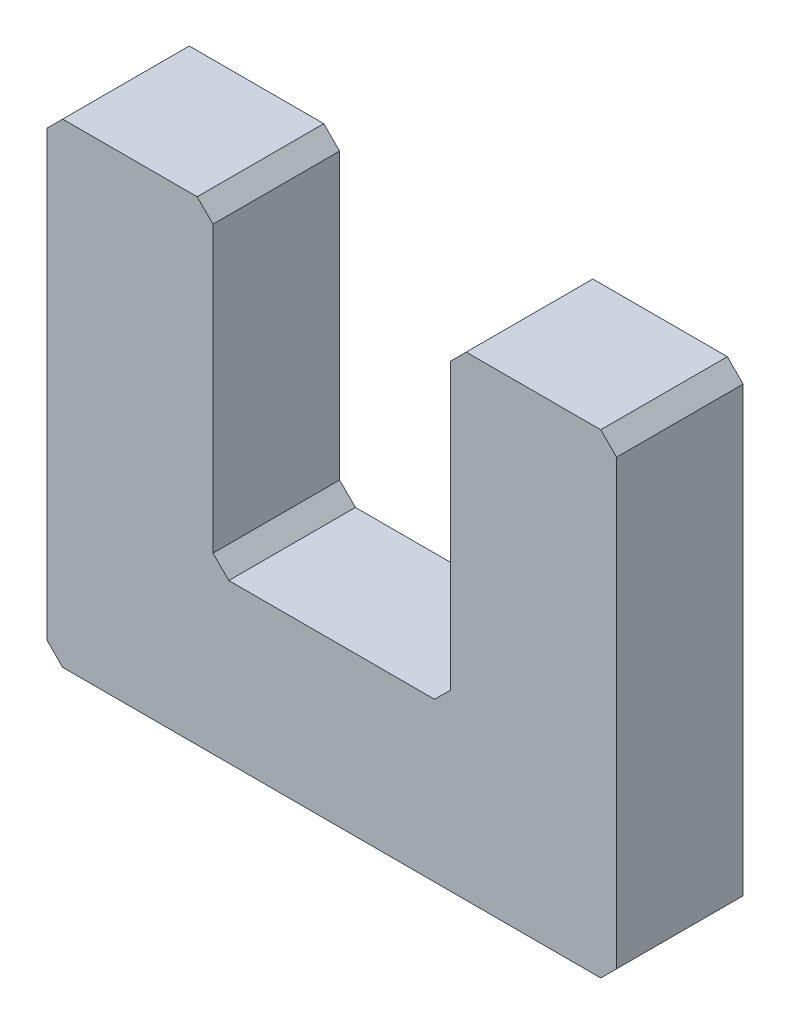
ISO-10303-21;
HEADER;
FILE_DESCRIPTION(('STEP AP214'),'2;1');
FILE_NAME('part.step','',(''),(''),'','','');
FILE_SCHEMA(('AUTOMOTIVE_DESIGN { 1 0 10303 214 1 1 1 1 }'));
ENDSEC;
DATA;
#1=APPLICATION_CONTEXT('core data for automotive mechanical design processes');
#2=APPLICATION_PROTOCOL_DEFINITION('international standard','automotive_design',2000,#1);
#3=PRODUCT_CONTEXT('',#1,'mechanical');
#4=PRODUCT('Part','Part','',(#3));
#5=PRODUCT_RELATED_PRODUCT_CATEGORY('part','',(#4));
#6=PRODUCT_DEFINITION_FORMATION('','',#4);
#7=PRODUCT_DEFINITION_CONTEXT('part definition',#1,'design');
#8=PRODUCT_DEFINITION('design','',#6,#7);
#9=PRODUCT_DEFINITION_SHAPE('','',#8);
#10=(LENGTH_UNIT() NAMED_UNIT(*) SI_UNIT(.MILLI.,.METRE.));
#11=(NAMED_UNIT(*) PLANE_ANGLE_UNIT() SI_UNIT($,.RADIAN.));
#12=(NAMED_UNIT(*) SI_UNIT($,.STERADIAN.) SOLID_ANGLE_UNIT());
#13=UNCERTAINTY_MEASURE_WITH_UNIT(LENGTH_MEASURE(1.E-05),#10,'distance_accuracy_value','');
#14=(GEOMETRIC_REPRESENTATION_CONTEXT(3) GLOBAL_UNCERTAINTY_ASSIGNED_CONTEXT((#13)) GLOBAL_UNIT_ASSIGNED_CONTEXT((#10,
#11,#12)) REPRESENTATION_CONTEXT('',''));
#15=CARTESIAN_POINT('',(0.,0.,0.));
#16=DIRECTION('',(0.,0.,1.));
#17=DIRECTION('',(1.,0.,0.));
#18=AXIS2_PLACEMENT_3D('',#15,#16,#17);
#19=CARTESIAN_POINT('',(-18.,15.,8.));
#20=DIRECTION('',(0.,-1.,0.));
#21=DIRECTION('',(0.,0.,-1.));
#22=AXIS2_PLACEMENT_3D('',#19,#20,#21);
#23=PLANE('',#22);
#24=DIRECTION('',(-1.,0.,0.));
#25=VECTOR('',#24,1.);
#26=CARTESIAN_POINT('',(-18.,15.,0.));
#27=LINE('',#26,#25);
#28=CARTESIAN_POINT('',(17.,15.,0.));
#29=VERTEX_POINT('',#28);
#30=CARTESIAN_POINT('',(8.50000000000001,15.,0.));
#31=VERTEX_POINT('',#30);
#32=EDGE_CURVE('E201',#29,#31,#27,.T.);
#33=ORIENTED_EDGE('',*,*,#32,.T.);
#34=DIRECTION('',(0.,0.,1.));
#35=VECTOR('',#34,1.);
#36=CARTESIAN_POINT('',(8.50000000000001,15.,8.));
#37=LINE('',#36,#35);
#38=CARTESIAN_POINT('',(8.50000000000001,15.,8.));
#39=VERTEX_POINT('',#38);
#40=EDGE_CURVE('E246',#31,#39,#37,.T.);
#41=ORIENTED_EDGE('',*,*,#40,.T.);
#42=DIRECTION('',(-1.,0.,0.));
#43=VECTOR('',#42,1.);
#44=CARTESIAN_POINT('',(-18.,15.,8.));
#45=LINE('',#44,#43);
#46=CARTESIAN_POINT('',(17.,15.,8.));
#47=VERTEX_POINT('',#46);
#48=EDGE_CURVE('E299',#47,#39,#45,.T.);
#49=ORIENTED_EDGE('',*,*,#48,.F.);
#50=DIRECTION('',(0.,0.,-1.));
#51=VECTOR('',#50,1.);
#52=CARTESIAN_POINT('',(17.,15.,8.));
#53=LINE('',#52,#51);
#54=EDGE_CURVE('E242',#47,#29,#53,.T.);
#55=ORIENTED_EDGE('',*,*,#54,.T.);
#56=EDGE_LOOP('',(#33,#41,#49,#55));
#57=FACE_BOUND('',#56,.T.);
#58=ADVANCED_FACE('F47',(#57),#23,.F.);
#59=CARTESIAN_POINT('',(18.,-15.,8.));
#60=DIRECTION('',(-1.,0.,0.));
#61=DIRECTION('',(0.,0.,1.));
#62=AXIS2_PLACEMENT_3D('',#59,#60,#61);
#63=PLANE('',#62);
#64=DIRECTION('',(0.,1.,0.));
#65=VECTOR('',#64,1.);
#66=CARTESIAN_POINT('',(18.,-15.,8.));
#67=LINE('',#66,#65);
#68=CARTESIAN_POINT('',(18.,-14.,8.));
#69=VERTEX_POINT('',#68);
#70=CARTESIAN_POINT('',(18.,14.,8.));
#71=VERTEX_POINT('',#70);
#72=EDGE_CURVE('E193',#69,#71,#67,.T.);
#73=ORIENTED_EDGE('',*,*,#72,.F.);
#74=DIRECTION('',(0.,0.,-1.));
#75=VECTOR('',#74,1.);
#76=CARTESIAN_POINT('',(18.,-14.,8.));
#77=LINE('',#76,#75);
#78=CARTESIAN_POINT('',(18.,-14.,0.));
#79=VERTEX_POINT('',#78);
#80=EDGE_CURVE('E238',#69,#79,#77,.T.);
#81=ORIENTED_EDGE('',*,*,#80,.T.);
#82=DIRECTION('',(0.,1.,0.));
#83=VECTOR('',#82,1.);
#84=CARTESIAN_POINT('',(18.,-15.,0.));
#85=LINE('',#84,#83);
#86=CARTESIAN_POINT('',(18.,14.,0.));
#87=VERTEX_POINT('',#86);
#88=EDGE_CURVE('E307',#79,#87,#85,.T.);
#89=ORIENTED_EDGE('',*,*,#88,.T.);
#90=DIRECTION('',(0.,0.,1.));
#91=VECTOR('',#90,1.);
#92=CARTESIAN_POINT('',(18.,14.,8.));
#93=LINE('',#92,#91);
#94=EDGE_CURVE('E235',#87,#71,#93,.T.);
#95=ORIENTED_EDGE('',*,*,#94,.T.);
#96=EDGE_LOOP('',(#73,#81,#89,#95));
#97=FACE_BOUND('',#96,.T.);
#98=ADVANCED_FACE('F340',(#97),#63,.F.);
#99=CARTESIAN_POINT('',(-8.50000000000001,15.,8.));
#100=VERTEX_POINT('',#99);
#101=CARTESIAN_POINT('',(-17.,15.,8.));
#102=VERTEX_POINT('',#101);
#103=EDGE_CURVE('E199',#100,#102,#45,.T.);
#104=ORIENTED_EDGE('',*,*,#103,.F.);
#105=DIRECTION('',(0.,0.,-1.));
#106=VECTOR('',#105,1.);
#107=CARTESIAN_POINT('',(-8.50000000000001,15.,8.));
#108=LINE('',#107,#106);
#109=CARTESIAN_POINT('',(-8.50000000000001,15.,0.));
#110=VERTEX_POINT('',#109);
#111=EDGE_CURVE('E271',#100,#110,#108,.T.);
#112=ORIENTED_EDGE('',*,*,#111,.T.);
#113=CARTESIAN_POINT('',(-17.,15.,0.));
#114=VERTEX_POINT('',#113);
#115=EDGE_CURVE('E310',#110,#114,#27,.T.);
#116=ORIENTED_EDGE('',*,*,#115,.T.);
#117=DIRECTION('',(0.,0.,1.));
#118=VECTOR('',#117,1.);
#119=CARTESIAN_POINT('',(-17.,15.,8.));
#120=LINE('',#119,#118);
#121=EDGE_CURVE('E231',#114,#102,#120,.T.);
#122=ORIENTED_EDGE('',*,*,#121,.T.);
#123=EDGE_LOOP('',(#104,#112,#116,#122));
#124=FACE_BOUND('',#123,.T.);
#125=ADVANCED_FACE('F320',(#124),#23,.F.);
#126=CARTESIAN_POINT('',(-18.,-15.,8.));
#127=DIRECTION('',(1.,0.,0.));
#128=DIRECTION('',(0.,0.,-1.));
#129=AXIS2_PLACEMENT_3D('',#126,#127,#128);
#130=PLANE('',#129);
#131=DIRECTION('',(0.,-1.,0.));
#132=VECTOR('',#131,1.);
#133=CARTESIAN_POINT('',(-18.,-15.,0.));
#134=LINE('',#133,#132);
#135=CARTESIAN_POINT('',(-18.,14.,0.));
#136=VERTEX_POINT('',#135);
#137=CARTESIAN_POINT('',(-18.,-14.,0.));
#138=VERTEX_POINT('',#137);
#139=EDGE_CURVE('E194',#136,#138,#134,.T.);
#140=ORIENTED_EDGE('',*,*,#139,.T.);
#141=DIRECTION('',(0.,0.,1.));
#142=VECTOR('',#141,1.);
#143=CARTESIAN_POINT('',(-18.,-14.,8.));
#144=LINE('',#143,#142);
#145=CARTESIAN_POINT('',(-18.,-14.,8.));
#146=VERTEX_POINT('',#145);
#147=EDGE_CURVE('E167',#138,#146,#144,.T.);
#148=ORIENTED_EDGE('',*,*,#147,.T.);
#149=DIRECTION('',(0.,-1.,0.));
#150=VECTOR('',#149,1.);
#151=CARTESIAN_POINT('',(-18.,-15.,8.));
#152=LINE('',#151,#150);
#153=CARTESIAN_POINT('',(-18.,14.,8.));
#154=VERTEX_POINT('',#153);
#155=EDGE_CURVE('E295',#154,#146,#152,.T.);
#156=ORIENTED_EDGE('',*,*,#155,.F.);
#157=DIRECTION('',(0.,0.,-1.));
#158=VECTOR('',#157,1.);
#159=CARTESIAN_POINT('',(-18.,14.,8.));
#160=LINE('',#159,#158);
#161=EDGE_CURVE('E173',#154,#136,#160,.T.);
#162=ORIENTED_EDGE('',*,*,#161,.T.);
#163=EDGE_LOOP('',(#140,#148,#156,#162));
#164=FACE_BOUND('',#163,.T.);
#165=ADVANCED_FACE('F331',(#164),#130,.F.);
#166=CARTESIAN_POINT('',(-18.,-15.,8.));
#167=DIRECTION('',(0.,1.,0.));
#168=DIRECTION('',(0.,0.,1.));
#169=AXIS2_PLACEMENT_3D('',#166,#167,#168);
#170=PLANE('',#169);
#171=DIRECTION('',(1.,0.,0.));
#172=VECTOR('',#171,1.);
#173=CARTESIAN_POINT('',(-18.,-15.,8.));
#174=LINE('',#173,#172);
#175=CARTESIAN_POINT('',(-17.,-15.,8.));
#176=VERTEX_POINT('',#175);
#177=CARTESIAN_POINT('',(17.,-15.,8.));
#178=VERTEX_POINT('',#177);
#179=EDGE_CURVE('E183',#176,#178,#174,.T.);
#180=ORIENTED_EDGE('',*,*,#179,.F.);
#181=DIRECTION('',(0.,0.,-1.));
#182=VECTOR('',#181,1.);
#183=CARTESIAN_POINT('',(-17.,-15.,8.));
#184=LINE('',#183,#182);
#185=CARTESIAN_POINT('',(-17.,-15.,0.));
#186=VERTEX_POINT('',#185);
#187=EDGE_CURVE('E166',#176,#186,#184,.T.);
#188=ORIENTED_EDGE('',*,*,#187,.T.);
#189=DIRECTION('',(1.,0.,0.));
#190=VECTOR('',#189,1.);
#191=CARTESIAN_POINT('',(-18.,-15.,0.));
#192=LINE('',#191,#190);
#193=CARTESIAN_POINT('',(17.,-15.,0.));
#194=VERTEX_POINT('',#193);
#195=EDGE_CURVE('E180',#186,#194,#192,.T.);
#196=ORIENTED_EDGE('',*,*,#195,.T.);
#197=DIRECTION('',(0.,0.,1.));
#198=VECTOR('',#197,1.);
#199=CARTESIAN_POINT('',(17.,-15.,8.));
#200=LINE('',#199,#198);
#201=EDGE_CURVE('E186',#194,#178,#200,.T.);
#202=ORIENTED_EDGE('',*,*,#201,.T.);
#203=EDGE_LOOP('',(#180,#188,#196,#202));
#204=FACE_BOUND('',#203,.T.);
#205=ADVANCED_FACE('F179',(#204),#170,.F.);
#206=CARTESIAN_POINT('',(0.,0.,8.));
#207=DIRECTION('',(0.,0.,-1.));
#208=DIRECTION('',(-1.,0.,0.));
#209=AXIS2_PLACEMENT_3D('',#206,#207,#208);
#210=PLANE('',#209);
#211=ORIENTED_EDGE('',*,*,#48,.T.);
#212=DIRECTION('',(0.707106781186544,0.707106781186551,0.));
#213=VECTOR('',#212,1.);
#214=CARTESIAN_POINT('',(8.50000000000001,15.,8.));
#215=LINE('',#214,#213);
#216=CARTESIAN_POINT('',(7.5,14.,8.));
#217=VERTEX_POINT('',#216);
#218=EDGE_CURVE('E253',#39,#217,#215,.F.);
#219=ORIENTED_EDGE('',*,*,#218,.T.);
#220=DIRECTION('',(0.,1.,0.));
#221=VECTOR('',#220,1.);
#222=CARTESIAN_POINT('',(7.5,15.,8.));
#223=LINE('',#222,#221);
#224=CARTESIAN_POINT('',(7.5,-4.,8.));
#225=VERTEX_POINT('',#224);
#226=EDGE_CURVE('E421',#225,#217,#223,.T.);
#227=ORIENTED_EDGE('',*,*,#226,.F.);
#228=DIRECTION('',(0.707106781186545,0.70710678118655,0.));
#229=VECTOR('',#228,1.);
#230=CARTESIAN_POINT('',(5.75000000000003,-5.74999999999999,8.));
#231=LINE('',#230,#229);
#232=CARTESIAN_POINT('',(6.50000000000001,-5.,8.));
#233=VERTEX_POINT('',#232);
#234=EDGE_CURVE('E287',#225,#233,#231,.F.);
#235=ORIENTED_EDGE('',*,*,#234,.T.);
#236=DIRECTION('',(1.,0.,0.));
#237=VECTOR('',#236,1.);
#238=CARTESIAN_POINT('',(7.5,-5.,8.));
#239=LINE('',#238,#237);
#240=CARTESIAN_POINT('',(-6.49999999999999,-5.,8.));
#241=VERTEX_POINT('',#240);
#242=EDGE_CURVE('E414',#241,#233,#239,.T.);
#243=ORIENTED_EDGE('',*,*,#242,.F.);
#244=DIRECTION('',(0.707106781186549,-0.707106781186546,0.));
#245=VECTOR('',#244,1.);
#246=CARTESIAN_POINT('',(-5.74999999999998,-5.75000000000001,8.));
#247=LINE('',#246,#245);
#248=CARTESIAN_POINT('',(-7.5,-4.,8.));
#249=VERTEX_POINT('',#248);
#250=EDGE_CURVE('E57',#241,#249,#247,.F.);
#251=ORIENTED_EDGE('',*,*,#250,.T.);
#252=DIRECTION('',(0.,-1.,0.));
#253=VECTOR('',#252,1.);
#254=CARTESIAN_POINT('',(-7.5,15.,8.));
#255=LINE('',#254,#253);
#256=CARTESIAN_POINT('',(-7.5,14.,8.));
#257=VERTEX_POINT('',#256);
#258=EDGE_CURVE('E410',#257,#249,#255,.T.);
#259=ORIENTED_EDGE('',*,*,#258,.F.);
#260=DIRECTION('',(0.707106781186548,-0.707106781186548,0.));
#261=VECTOR('',#260,1.);
#262=CARTESIAN_POINT('',(-7.5,14.,8.));
#263=LINE('',#262,#261);
#264=EDGE_CURVE('E250',#257,#100,#263,.F.);
#265=ORIENTED_EDGE('',*,*,#264,.T.);
#266=ORIENTED_EDGE('',*,*,#103,.T.);
#267=DIRECTION('',(0.707106781186548,0.707106781186548,0.));
#268=VECTOR('',#267,1.);
#269=CARTESIAN_POINT('',(-18.,14.,8.));
#270=LINE('',#269,#268);
#271=EDGE_CURVE('E225',#102,#154,#270,.F.);
#272=ORIENTED_EDGE('',*,*,#271,.T.);
#273=ORIENTED_EDGE('',*,*,#155,.T.);
#274=DIRECTION('',(-0.707106781186548,0.707106781186548,0.));
#275=VECTOR('',#274,1.);
#276=CARTESIAN_POINT('',(-17.,-15.,8.));
#277=LINE('',#276,#275);
#278=EDGE_CURVE('E228',#146,#176,#277,.F.);
#279=ORIENTED_EDGE('',*,*,#278,.T.);
#280=ORIENTED_EDGE('',*,*,#179,.T.);
#281=DIRECTION('',(-0.707106781186546,-0.707106781186549,0.));
#282=VECTOR('',#281,1.);
#283=CARTESIAN_POINT('',(18.,-14.,8.));
#284=LINE('',#283,#282);
#285=EDGE_CURVE('E222',#178,#69,#284,.F.);
#286=ORIENTED_EDGE('',*,*,#285,.T.);
#287=ORIENTED_EDGE('',*,*,#72,.T.);
#288=DIRECTION('',(0.707106781186549,-0.707106781186546,0.));
#289=VECTOR('',#288,1.);
#290=CARTESIAN_POINT('',(17.,15.,8.));
#291=LINE('',#290,#289);
#292=EDGE_CURVE('E219',#71,#47,#291,.F.);
#293=ORIENTED_EDGE('',*,*,#292,.T.);
#294=EDGE_LOOP('',(#211,#219,#227,#235,#243,#251,#259,#265,#266,#272,#273,#279,#280,#286,#287,#293));
#295=FACE_BOUND('',#294,.T.);
#296=ADVANCED_FACE('F329',(#295),#210,.F.);
#297=CARTESIAN_POINT('',(0.,0.,0.));
#298=DIRECTION('',(0.,0.,-1.));
#299=DIRECTION('',(-1.,0.,0.));
#300=AXIS2_PLACEMENT_3D('',#297,#298,#299);
#301=PLANE('',#300);
#302=DIRECTION('',(1.,0.,0.));
#303=VECTOR('',#302,1.);
#304=CARTESIAN_POINT('',(7.5,-5.,0.));
#305=LINE('',#304,#303);
#306=CARTESIAN_POINT('',(-6.49999999999999,-5.,0.));
#307=VERTEX_POINT('',#306);
#308=CARTESIAN_POINT('',(6.50000000000001,-5.,0.));
#309=VERTEX_POINT('',#308);
#310=EDGE_CURVE('E403',#307,#309,#305,.T.);
#311=ORIENTED_EDGE('',*,*,#310,.T.);
#312=DIRECTION('',(-0.707106781186545,-0.70710678118655,0.));
#313=VECTOR('',#312,1.);
#314=CARTESIAN_POINT('',(7.5,-4.,0.));
#315=LINE('',#314,#313);
#316=CARTESIAN_POINT('',(7.5,-4.,0.));
#317=VERTEX_POINT('',#316);
#318=EDGE_CURVE('E290',#309,#317,#315,.F.);
#319=ORIENTED_EDGE('',*,*,#318,.T.);
#320=DIRECTION('',(0.,1.,0.));
#321=VECTOR('',#320,1.);
#322=CARTESIAN_POINT('',(7.5,15.,0.));
#323=LINE('',#322,#321);
#324=CARTESIAN_POINT('',(7.5,14.,0.));
#325=VERTEX_POINT('',#324);
#326=EDGE_CURVE('E401',#317,#325,#323,.T.);
#327=ORIENTED_EDGE('',*,*,#326,.T.);
#328=DIRECTION('',(-0.707106781186544,-0.707106781186551,0.));
#329=VECTOR('',#328,1.);
#330=CARTESIAN_POINT('',(-3.24999999999995,3.24999999999992,0.));
#331=LINE('',#330,#329);
#332=EDGE_CURVE('E264',#325,#31,#331,.F.);
#333=ORIENTED_EDGE('',*,*,#332,.T.);
#334=ORIENTED_EDGE('',*,*,#32,.F.);
#335=DIRECTION('',(-0.707106781186549,0.707106781186546,0.));
#336=VECTOR('',#335,1.);
#337=CARTESIAN_POINT('',(16.,16.,0.));
#338=LINE('',#337,#336);
#339=EDGE_CURVE('E185',#29,#87,#338,.F.);
#340=ORIENTED_EDGE('',*,*,#339,.T.);
#341=ORIENTED_EDGE('',*,*,#88,.F.);
#342=DIRECTION('',(0.707106781186546,0.707106781186549,0.));
#343=VECTOR('',#342,1.);
#344=CARTESIAN_POINT('',(16.,-16.,0.));
#345=LINE('',#344,#343);
#346=EDGE_CURVE('E191',#79,#194,#345,.F.);
#347=ORIENTED_EDGE('',*,*,#346,.T.);
#348=ORIENTED_EDGE('',*,*,#195,.F.);
#349=DIRECTION('',(0.707106781186548,-0.707106781186548,0.));
#350=VECTOR('',#349,1.);
#351=CARTESIAN_POINT('',(-16.,-16.,0.));
#352=LINE('',#351,#350);
#353=EDGE_CURVE('E162',#186,#138,#352,.F.);
#354=ORIENTED_EDGE('',*,*,#353,.T.);
#355=ORIENTED_EDGE('',*,*,#139,.F.);
#356=DIRECTION('',(-0.707106781186548,-0.707106781186548,0.));
#357=VECTOR('',#356,1.);
#358=CARTESIAN_POINT('',(-16.,16.,0.));
#359=LINE('',#358,#357);
#360=EDGE_CURVE('E174',#136,#114,#359,.F.);
#361=ORIENTED_EDGE('',*,*,#360,.T.);
#362=ORIENTED_EDGE('',*,*,#115,.F.);
#363=DIRECTION('',(-0.707106781186548,0.707106781186548,0.));
#364=VECTOR('',#363,1.);
#365=CARTESIAN_POINT('',(3.25,3.25,0.));
#366=LINE('',#365,#364);
#367=CARTESIAN_POINT('',(-7.5,14.,0.));
#368=VERTEX_POINT('',#367);
#369=EDGE_CURVE('E261',#110,#368,#366,.F.);
#370=ORIENTED_EDGE('',*,*,#369,.T.);
#371=DIRECTION('',(0.,-1.,0.));
#372=VECTOR('',#371,1.);
#373=CARTESIAN_POINT('',(-7.5,15.,0.));
#374=LINE('',#373,#372);
#375=CARTESIAN_POINT('',(-7.5,-4.,0.));
#376=VERTEX_POINT('',#375);
#377=EDGE_CURVE('E311',#368,#376,#374,.T.);
#378=ORIENTED_EDGE('',*,*,#377,.T.);
#379=DIRECTION('',(-0.707106781186549,0.707106781186546,0.));
#380=VECTOR('',#379,1.);
#381=CARTESIAN_POINT('',(-6.49999999999999,-5.,0.));
#382=LINE('',#381,#380);
#383=EDGE_CURVE('E11',#376,#307,#382,.F.);
#384=ORIENTED_EDGE('',*,*,#383,.T.);
#385=EDGE_LOOP('',(#311,#319,#327,#333,#334,#340,#341,#347,#348,#354,#355,#361,#362,#370,#378,#384));
#386=FACE_BOUND('',#385,.T.);
#387=ADVANCED_FACE('F189',(#386),#301,.T.);
#388=CARTESIAN_POINT('',(7.5,15.,-0.000999999999999265));
#389=DIRECTION('',(1.,0.,0.));
#390=DIRECTION('',(0.,1.,0.));
#391=AXIS2_PLACEMENT_3D('',#388,#389,#390);
#392=PLANE('',#391);
#393=ORIENTED_EDGE('',*,*,#326,.F.);
#394=DIRECTION('',(0.,0.,1.));
#395=VECTOR('',#394,1.);
#396=CARTESIAN_POINT('',(7.5,-4.,8.));
#397=LINE('',#396,#395);
#398=EDGE_CURVE('E274',#317,#225,#397,.T.);
#399=ORIENTED_EDGE('',*,*,#398,.T.);
#400=ORIENTED_EDGE('',*,*,#226,.T.);
#401=DIRECTION('',(0.,0.,-1.));
#402=VECTOR('',#401,1.);
#403=CARTESIAN_POINT('',(7.5,14.,-0.000999999999999265));
#404=LINE('',#403,#402);
#405=EDGE_CURVE('E257',#217,#325,#404,.T.);
#406=ORIENTED_EDGE('',*,*,#405,.T.);
#407=EDGE_LOOP('',(#393,#399,#400,#406));
#408=FACE_BOUND('',#407,.T.);
#409=ADVANCED_FACE('F405',(#408),#392,.F.);
#410=CARTESIAN_POINT('',(7.5,-5.,-0.000999999999999265));
#411=DIRECTION('',(0.,-1.,0.));
#412=DIRECTION('',(1.,0.,0.));
#413=AXIS2_PLACEMENT_3D('',#410,#411,#412);
#414=PLANE('',#413);
#415=ORIENTED_EDGE('',*,*,#242,.T.);
#416=DIRECTION('',(0.,0.,-1.));
#417=VECTOR('',#416,1.);
#418=CARTESIAN_POINT('',(6.50000000000001,-5.,0.));
#419=LINE('',#418,#417);
#420=EDGE_CURVE('E282',#233,#309,#419,.T.);
#421=ORIENTED_EDGE('',*,*,#420,.T.);
#422=ORIENTED_EDGE('',*,*,#310,.F.);
#423=DIRECTION('',(0.,0.,1.));
#424=VECTOR('',#423,1.);
#425=CARTESIAN_POINT('',(-6.49999999999999,-5.,8.));
#426=LINE('',#425,#424);
#427=EDGE_CURVE('E278',#307,#241,#426,.T.);
#428=ORIENTED_EDGE('',*,*,#427,.T.);
#429=EDGE_LOOP('',(#415,#421,#422,#428));
#430=FACE_BOUND('',#429,.T.);
#431=ADVANCED_FACE('F428',(#430),#414,.F.);
#432=CARTESIAN_POINT('',(-7.5,15.,-0.000999999999999265));
#433=DIRECTION('',(-1.,0.,0.));
#434=DIRECTION('',(0.,-1.,0.));
#435=AXIS2_PLACEMENT_3D('',#432,#433,#434);
#436=PLANE('',#435);
#437=ORIENTED_EDGE('',*,*,#258,.T.);
#438=DIRECTION('',(0.,0.,-1.));
#439=VECTOR('',#438,1.);
#440=CARTESIAN_POINT('',(-7.5,-4.,0.));
#441=LINE('',#440,#439);
#442=EDGE_CURVE('E70',#249,#376,#441,.T.);
#443=ORIENTED_EDGE('',*,*,#442,.T.);
#444=ORIENTED_EDGE('',*,*,#377,.F.);
#445=DIRECTION('',(0.,0.,1.));
#446=VECTOR('',#445,1.);
#447=CARTESIAN_POINT('',(-7.5,14.,-0.000999999999999265));
#448=LINE('',#447,#446);
#449=EDGE_CURVE('E267',#368,#257,#448,.T.);
#450=ORIENTED_EDGE('',*,*,#449,.T.);
#451=EDGE_LOOP('',(#437,#443,#444,#450));
#452=FACE_BOUND('',#451,.T.);
#453=ADVANCED_FACE('F355',(#452),#436,.F.);
#454=CARTESIAN_POINT('',(-17.,-15.,8.));
#455=DIRECTION('',(0.707106781186547,0.707106781186547,0.));
#456=DIRECTION('',(0.,0.,-1.));
#457=AXIS2_PLACEMENT_3D('',#454,#455,#456);
#458=PLANE('',#457);
#459=ORIENTED_EDGE('',*,*,#278,.F.);
#460=ORIENTED_EDGE('',*,*,#147,.F.);
#461=ORIENTED_EDGE('',*,*,#353,.F.);
#462=ORIENTED_EDGE('',*,*,#187,.F.);
#463=EDGE_LOOP('',(#459,#460,#461,#462));
#464=FACE_BOUND('',#463,.T.);
#465=ADVANCED_FACE('F165',(#464),#458,.F.);
#466=CARTESIAN_POINT('',(-18.,14.,8.));
#467=DIRECTION('',(0.707106781186547,-0.707106781186547,0.));
#468=DIRECTION('',(0.,0.,-1.));
#469=AXIS2_PLACEMENT_3D('',#466,#467,#468);
#470=PLANE('',#469);
#471=ORIENTED_EDGE('',*,*,#271,.F.);
#472=ORIENTED_EDGE('',*,*,#121,.F.);
#473=ORIENTED_EDGE('',*,*,#360,.F.);
#474=ORIENTED_EDGE('',*,*,#161,.F.);
#475=EDGE_LOOP('',(#471,#472,#473,#474));
#476=FACE_BOUND('',#475,.T.);
#477=ADVANCED_FACE('F327',(#476),#470,.F.);
#478=CARTESIAN_POINT('',(18.,-14.,8.));
#479=DIRECTION('',(-0.707106781186549,0.707106781186546,0.));
#480=DIRECTION('',(0.,0.,-1.));
#481=AXIS2_PLACEMENT_3D('',#478,#479,#480);
#482=PLANE('',#481);
#483=ORIENTED_EDGE('',*,*,#285,.F.);
#484=ORIENTED_EDGE('',*,*,#201,.F.);
#485=ORIENTED_EDGE('',*,*,#346,.F.);
#486=ORIENTED_EDGE('',*,*,#80,.F.);
#487=EDGE_LOOP('',(#483,#484,#485,#486));
#488=FACE_BOUND('',#487,.T.);
#489=ADVANCED_FACE('F361',(#488),#482,.F.);
#490=CARTESIAN_POINT('',(17.,15.,8.));
#491=DIRECTION('',(-0.707106781186546,-0.707106781186549,0.));
#492=DIRECTION('',(0.,0.,-1.));
#493=AXIS2_PLACEMENT_3D('',#490,#491,#492);
#494=PLANE('',#493);
#495=ORIENTED_EDGE('',*,*,#292,.F.);
#496=ORIENTED_EDGE('',*,*,#94,.F.);
#497=ORIENTED_EDGE('',*,*,#339,.F.);
#498=ORIENTED_EDGE('',*,*,#54,.F.);
#499=EDGE_LOOP('',(#495,#496,#497,#498));
#500=FACE_BOUND('',#499,.T.);
#501=ADVANCED_FACE('F367',(#500),#494,.F.);
#502=CARTESIAN_POINT('',(8.50000000000001,15.,8.));
#503=DIRECTION('',(0.707106781186551,-0.707106781186544,0.));
#504=DIRECTION('',(0.,0.,1.));
#505=AXIS2_PLACEMENT_3D('',#502,#503,#504);
#506=PLANE('',#505);
#507=ORIENTED_EDGE('',*,*,#332,.F.);
#508=ORIENTED_EDGE('',*,*,#405,.F.);
#509=ORIENTED_EDGE('',*,*,#218,.F.);
#510=ORIENTED_EDGE('',*,*,#40,.F.);
#511=EDGE_LOOP('',(#507,#508,#509,#510));
#512=FACE_BOUND('',#511,.T.);
#513=ADVANCED_FACE('F373',(#512),#506,.F.);
#514=CARTESIAN_POINT('',(-7.5,14.,-0.000999999999999265));
#515=DIRECTION('',(-0.707106781186547,-0.707106781186547,0.));
#516=DIRECTION('',(0.,0.,1.));
#517=AXIS2_PLACEMENT_3D('',#514,#515,#516);
#518=PLANE('',#517);
#519=ORIENTED_EDGE('',*,*,#369,.F.);
#520=ORIENTED_EDGE('',*,*,#111,.F.);
#521=ORIENTED_EDGE('',*,*,#264,.F.);
#522=ORIENTED_EDGE('',*,*,#449,.F.);
#523=EDGE_LOOP('',(#519,#520,#521,#522));
#524=FACE_BOUND('',#523,.T.);
#525=ADVANCED_FACE('F380',(#524),#518,.F.);
#526=CARTESIAN_POINT('',(7.5,-4.,-0.000999999999999265));
#527=DIRECTION('',(-0.70710678118655,0.707106781186545,0.));
#528=DIRECTION('',(0.,0.,-1.));
#529=AXIS2_PLACEMENT_3D('',#526,#527,#528);
#530=PLANE('',#529);
#531=ORIENTED_EDGE('',*,*,#318,.F.);
#532=ORIENTED_EDGE('',*,*,#420,.F.);
#533=ORIENTED_EDGE('',*,*,#234,.F.);
#534=ORIENTED_EDGE('',*,*,#398,.F.);
#535=EDGE_LOOP('',(#531,#532,#533,#534));
#536=FACE_BOUND('',#535,.T.);
#537=ADVANCED_FACE('F386',(#536),#530,.T.);
#538=CARTESIAN_POINT('',(-6.49999999999999,-5.,-0.000999999999999265));
#539=DIRECTION('',(0.707106781186546,0.707106781186549,0.));
#540=DIRECTION('',(0.,0.,-1.));
#541=AXIS2_PLACEMENT_3D('',#538,#539,#540);
#542=PLANE('',#541);
#543=ORIENTED_EDGE('',*,*,#383,.F.);
#544=ORIENTED_EDGE('',*,*,#442,.F.);
#545=ORIENTED_EDGE('',*,*,#250,.F.);
#546=ORIENTED_EDGE('',*,*,#427,.F.);
#547=EDGE_LOOP('',(#543,#544,#545,#546));
#548=FACE_BOUND('',#547,.T.);
#549=ADVANCED_FACE('F50',(#548),#542,.T.);
#550=CLOSED_SHELL('',(#58,#98,#125,#165,#205,#296,#387,#409,#431,#453,#465,#477,#489,#501,#513,
#525,#537,#549));
#551=MANIFOLD_SOLID_BREP('B2',#550);
#552=ADVANCED_BREP_SHAPE_REPRESENTATION('',(#18,#551),#14);
#553=SHAPE_DEFINITION_REPRESENTATION(#9,#552);
ENDSEC;
END-ISO-10303-21;
